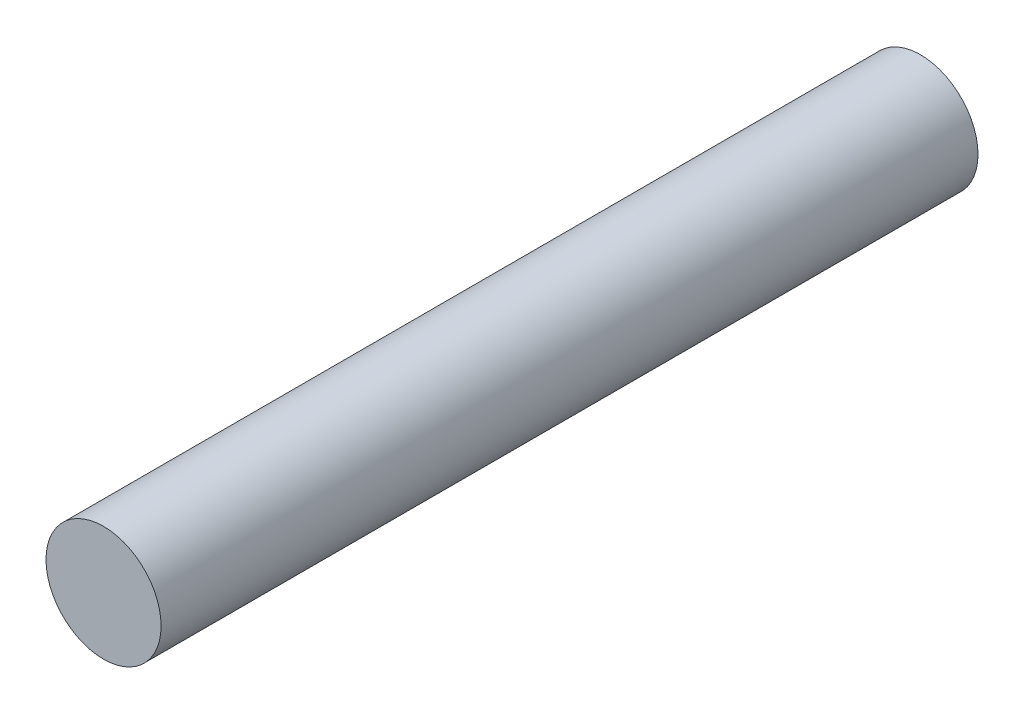
ISO-10303-21;
HEADER;
FILE_DESCRIPTION(('STEP AP214'),'2;1');
FILE_NAME('part.step','',(''),(''),'','','');
FILE_SCHEMA(('AUTOMOTIVE_DESIGN { 1 0 10303 214 1 1 1 1 }'));
ENDSEC;
DATA;
#1=APPLICATION_CONTEXT('core data for automotive mechanical design processes');
#2=APPLICATION_PROTOCOL_DEFINITION('international standard','automotive_design',2000,#1);
#3=PRODUCT_CONTEXT('',#1,'mechanical');
#4=PRODUCT('Part','Part','',(#3));
#5=PRODUCT_RELATED_PRODUCT_CATEGORY('part','',(#4));
#6=PRODUCT_DEFINITION_FORMATION('','',#4);
#7=PRODUCT_DEFINITION_CONTEXT('part definition',#1,'design');
#8=PRODUCT_DEFINITION('design','',#6,#7);
#9=PRODUCT_DEFINITION_SHAPE('','',#8);
#10=(LENGTH_UNIT() NAMED_UNIT(*) SI_UNIT(.MILLI.,.METRE.));
#11=(NAMED_UNIT(*) PLANE_ANGLE_UNIT() SI_UNIT($,.RADIAN.));
#12=(NAMED_UNIT(*) SI_UNIT($,.STERADIAN.) SOLID_ANGLE_UNIT());
#13=UNCERTAINTY_MEASURE_WITH_UNIT(LENGTH_MEASURE(1.E-05),#10,'distance_accuracy_value','');
#14=(GEOMETRIC_REPRESENTATION_CONTEXT(3) GLOBAL_UNCERTAINTY_ASSIGNED_CONTEXT((#13)) GLOBAL_UNIT_ASSIGNED_CONTEXT((#10,
#11,#12)) REPRESENTATION_CONTEXT('',''));
#15=CARTESIAN_POINT('',(0.,0.,0.));
#16=DIRECTION('',(0.,0.,1.));
#17=DIRECTION('',(1.,0.,0.));
#18=AXIS2_PLACEMENT_3D('',#15,#16,#17);
#19=CARTESIAN_POINT('',(0.,0.,11.3577510003558));
#20=DIRECTION('',(0.,0.,1.));
#21=DIRECTION('',(1.,0.,0.));
#22=AXIS2_PLACEMENT_3D('',#19,#20,#21);
#23=PLANE('',#22);
#24=CARTESIAN_POINT('',(0.,0.,11.3577510003558));
#25=DIRECTION('',(0.,0.,-1.));
#26=DIRECTION('',(-1.,0.,0.));
#27=AXIS2_PLACEMENT_3D('',#24,#25,#26);
#28=CIRCLE('',#27,1.6);
#29=CARTESIAN_POINT('',(-1.6,0.,11.3577510003558));
#30=VERTEX_POINT('',#29);
#31=EDGE_CURVE('E8',#30,#30,#28,.T.);
#32=ORIENTED_EDGE('',*,*,#31,.F.);
#33=EDGE_LOOP('',(#32));
#34=FACE_BOUND('',#33,.T.);
#35=ADVANCED_FACE('F13',(#34),#23,.T.);
#36=CARTESIAN_POINT('',(0.,0.,-11.3577510003558));
#37=DIRECTION('',(0.,0.,-1.));
#38=DIRECTION('',(-1.,0.,0.));
#39=AXIS2_PLACEMENT_3D('',#36,#37,#38);
#40=PLANE('',#39);
#41=CARTESIAN_POINT('',(0.,0.,-11.3577510003558));
#42=DIRECTION('',(0.,0.,1.));
#43=DIRECTION('',(1.,0.,0.));
#44=AXIS2_PLACEMENT_3D('',#41,#42,#43);
#45=CIRCLE('',#44,1.6);
#46=CARTESIAN_POINT('',(1.6,0.,-11.3577510003558));
#47=VERTEX_POINT('',#46);
#48=EDGE_CURVE('E20',#47,#47,#45,.T.);
#49=ORIENTED_EDGE('',*,*,#48,.F.);
#50=EDGE_LOOP('',(#49));
#51=FACE_BOUND('',#50,.T.);
#52=ADVANCED_FACE('F30',(#51),#40,.T.);
#53=CARTESIAN_POINT('',(0.,0.,-11.3577510003558));
#54=DIRECTION('',(0.,0.,1.));
#55=DIRECTION('',(1.,0.,0.));
#56=AXIS2_PLACEMENT_3D('',#53,#54,#55);
#57=CYLINDRICAL_SURFACE('',#56,1.6);
#58=ORIENTED_EDGE('',*,*,#31,.T.);
#59=EDGE_LOOP('',(#58));
#60=FACE_BOUND('',#59,.T.);
#61=ORIENTED_EDGE('',*,*,#48,.T.);
#62=EDGE_LOOP('',(#61));
#63=FACE_BOUND('',#62,.T.);
#64=ADVANCED_FACE('F15',(#60,#63),#57,.T.);
#65=CLOSED_SHELL('',(#35,#52,#64));
#66=MANIFOLD_SOLID_BREP('B1',#65);
#67=ADVANCED_BREP_SHAPE_REPRESENTATION('',(#18,#66),#14);
#68=SHAPE_DEFINITION_REPRESENTATION(#9,#67);
ENDSEC;
END-ISO-10303-21;
